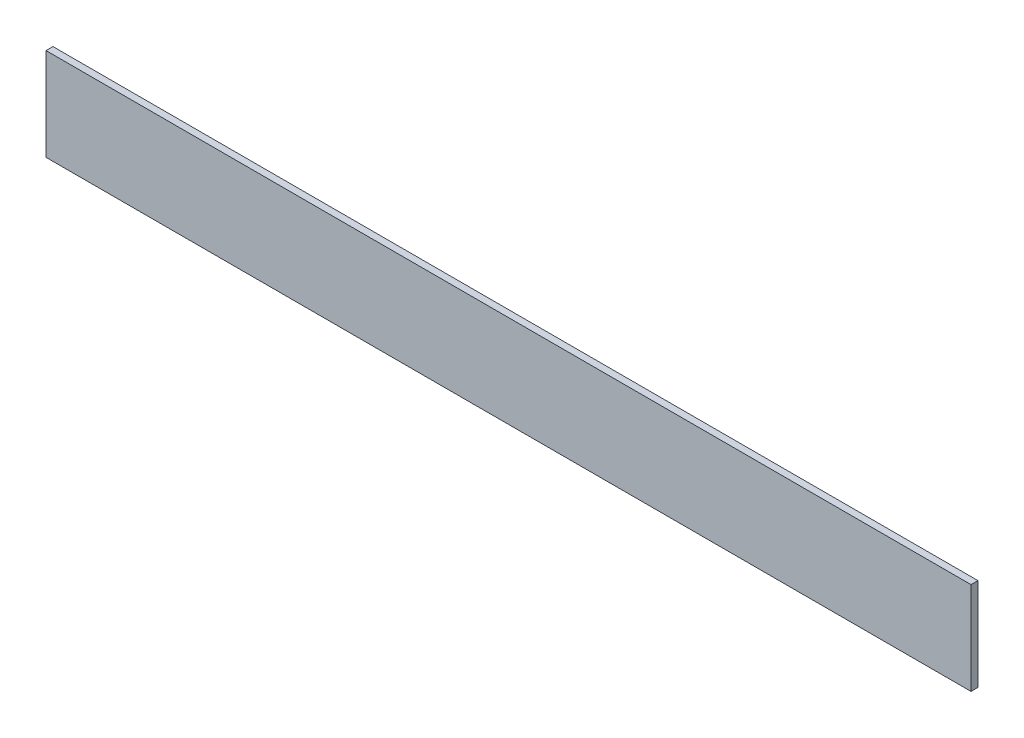
ISO-10303-21;
HEADER;
FILE_DESCRIPTION(('STEP AP214'),'2;1');
FILE_NAME('part.step','',(''),(''),'','','');
FILE_SCHEMA(('AUTOMOTIVE_DESIGN { 1 0 10303 214 1 1 1 1 }'));
ENDSEC;
DATA;
#1=APPLICATION_CONTEXT('core data for automotive mechanical design processes');
#2=APPLICATION_PROTOCOL_DEFINITION('international standard','automotive_design',2000,#1);
#3=PRODUCT_CONTEXT('',#1,'mechanical');
#4=PRODUCT('Part','Part','',(#3));
#5=PRODUCT_RELATED_PRODUCT_CATEGORY('part','',(#4));
#6=PRODUCT_DEFINITION_FORMATION('','',#4);
#7=PRODUCT_DEFINITION_CONTEXT('part definition',#1,'design');
#8=PRODUCT_DEFINITION('design','',#6,#7);
#9=PRODUCT_DEFINITION_SHAPE('','',#8);
#10=(LENGTH_UNIT() NAMED_UNIT(*) SI_UNIT(.MILLI.,.METRE.));
#11=(NAMED_UNIT(*) PLANE_ANGLE_UNIT() SI_UNIT($,.RADIAN.));
#12=(NAMED_UNIT(*) SI_UNIT($,.STERADIAN.) SOLID_ANGLE_UNIT());
#13=UNCERTAINTY_MEASURE_WITH_UNIT(LENGTH_MEASURE(1.E-05),#10,'distance_accuracy_value','');
#14=(GEOMETRIC_REPRESENTATION_CONTEXT(3) GLOBAL_UNCERTAINTY_ASSIGNED_CONTEXT((#13)) GLOBAL_UNIT_ASSIGNED_CONTEXT((#10,
#11,#12)) REPRESENTATION_CONTEXT('',''));
#15=CARTESIAN_POINT('',(0.,0.,0.));
#16=DIRECTION('',(0.,0.,1.));
#17=DIRECTION('',(1.,0.,0.));
#18=AXIS2_PLACEMENT_3D('',#15,#16,#17);
#19=CARTESIAN_POINT('',(-48.7333333333333,76.6666666666666,7.62));
#20=DIRECTION('',(1.,0.,0.));
#21=DIRECTION('',(0.,0.,-1.));
#22=AXIS2_PLACEMENT_3D('',#19,#20,#21);
#23=PLANE('',#22);
#24=DIRECTION('',(0.,-1.,0.));
#25=VECTOR('',#24,1.);
#26=CARTESIAN_POINT('',(-48.7333333333333,76.6666666666666,0.));
#27=LINE('',#26,#25);
#28=CARTESIAN_POINT('',(-48.7333333333333,76.6666666666666,0.));
#29=VERTEX_POINT('',#28);
#30=CARTESIAN_POINT('',(-48.7333333333333,-24.9333333333333,0.));
#31=VERTEX_POINT('',#30);
#32=EDGE_CURVE('E89',#29,#31,#27,.T.);
#33=ORIENTED_EDGE('',*,*,#32,.T.);
#34=DIRECTION('',(0.,0.,-1.));
#35=VECTOR('',#34,1.);
#36=CARTESIAN_POINT('',(-48.7333333333333,-24.9333333333333,7.62));
#37=LINE('',#36,#35);
#38=CARTESIAN_POINT('',(-48.7333333333333,-24.9333333333333,7.62));
#39=VERTEX_POINT('',#38);
#40=EDGE_CURVE('E12',#39,#31,#37,.T.);
#41=ORIENTED_EDGE('',*,*,#40,.F.);
#42=DIRECTION('',(0.,-1.,0.));
#43=VECTOR('',#42,1.);
#44=CARTESIAN_POINT('',(-48.7333333333333,76.6666666666666,7.62));
#45=LINE('',#44,#43);
#46=CARTESIAN_POINT('',(-48.7333333333333,76.6666666666666,7.62));
#47=VERTEX_POINT('',#46);
#48=EDGE_CURVE('E107',#47,#39,#45,.T.);
#49=ORIENTED_EDGE('',*,*,#48,.F.);
#50=DIRECTION('',(0.,0.,-1.));
#51=VECTOR('',#50,1.);
#52=CARTESIAN_POINT('',(-48.7333333333333,76.6666666666666,7.62));
#53=LINE('',#52,#51);
#54=EDGE_CURVE('E101',#47,#29,#53,.T.);
#55=ORIENTED_EDGE('',*,*,#54,.T.);
#56=EDGE_LOOP('',(#33,#41,#49,#55));
#57=FACE_BOUND('',#56,.T.);
#58=ADVANCED_FACE('F44',(#57),#23,.F.);
#59=CARTESIAN_POINT('',(-48.7333333333333,-24.9333333333333,7.62));
#60=DIRECTION('',(0.,1.,0.));
#61=DIRECTION('',(0.,0.,1.));
#62=AXIS2_PLACEMENT_3D('',#59,#60,#61);
#63=PLANE('',#62);
#64=DIRECTION('',(1.,0.,0.));
#65=VECTOR('',#64,1.);
#66=CARTESIAN_POINT('',(-48.7333333333333,-24.9333333333333,0.));
#67=LINE('',#66,#65);
#68=CARTESIAN_POINT('',(967.266666666667,-24.9333333333333,0.));
#69=VERTEX_POINT('',#68);
#70=EDGE_CURVE('E85',#31,#69,#67,.T.);
#71=ORIENTED_EDGE('',*,*,#70,.T.);
#72=DIRECTION('',(0.,0.,-1.));
#73=VECTOR('',#72,1.);
#74=CARTESIAN_POINT('',(967.266666666667,-24.9333333333333,7.62));
#75=LINE('',#74,#73);
#76=CARTESIAN_POINT('',(967.266666666667,-24.9333333333333,7.62));
#77=VERTEX_POINT('',#76);
#78=EDGE_CURVE('E52',#77,#69,#75,.T.);
#79=ORIENTED_EDGE('',*,*,#78,.F.);
#80=DIRECTION('',(1.,0.,0.));
#81=VECTOR('',#80,1.);
#82=CARTESIAN_POINT('',(-48.7333333333333,-24.9333333333333,7.62));
#83=LINE('',#82,#81);
#84=EDGE_CURVE('E97',#39,#77,#83,.T.);
#85=ORIENTED_EDGE('',*,*,#84,.F.);
#86=ORIENTED_EDGE('',*,*,#40,.T.);
#87=EDGE_LOOP('',(#71,#79,#85,#86));
#88=FACE_BOUND('',#87,.T.);
#89=ADVANCED_FACE('F96',(#88),#63,.F.);
#90=CARTESIAN_POINT('',(967.266666666667,76.6666666666666,7.62));
#91=DIRECTION('',(-1.,0.,0.));
#92=DIRECTION('',(0.,0.,1.));
#93=AXIS2_PLACEMENT_3D('',#90,#91,#92);
#94=PLANE('',#93);
#95=DIRECTION('',(0.,1.,0.));
#96=VECTOR('',#95,1.);
#97=CARTESIAN_POINT('',(967.266666666667,76.6666666666666,0.));
#98=LINE('',#97,#96);
#99=CARTESIAN_POINT('',(967.266666666667,76.6666666666666,0.));
#100=VERTEX_POINT('',#99);
#101=EDGE_CURVE('E90',#69,#100,#98,.T.);
#102=ORIENTED_EDGE('',*,*,#101,.T.);
#103=DIRECTION('',(0.,0.,-1.));
#104=VECTOR('',#103,1.);
#105=CARTESIAN_POINT('',(967.266666666667,76.6666666666666,7.62));
#106=LINE('',#105,#104);
#107=CARTESIAN_POINT('',(967.266666666667,76.6666666666666,7.62));
#108=VERTEX_POINT('',#107);
#109=EDGE_CURVE('E113',#108,#100,#106,.T.);
#110=ORIENTED_EDGE('',*,*,#109,.F.);
#111=DIRECTION('',(0.,1.,0.));
#112=VECTOR('',#111,1.);
#113=CARTESIAN_POINT('',(967.266666666667,76.6666666666666,7.62));
#114=LINE('',#113,#112);
#115=EDGE_CURVE('E64',#77,#108,#114,.T.);
#116=ORIENTED_EDGE('',*,*,#115,.F.);
#117=ORIENTED_EDGE('',*,*,#78,.T.);
#118=EDGE_LOOP('',(#102,#110,#116,#117));
#119=FACE_BOUND('',#118,.T.);
#120=ADVANCED_FACE('F116',(#119),#94,.F.);
#121=CARTESIAN_POINT('',(-48.7333333333333,76.6666666666666,7.62));
#122=DIRECTION('',(0.,-1.,0.));
#123=DIRECTION('',(0.,0.,-1.));
#124=AXIS2_PLACEMENT_3D('',#121,#122,#123);
#125=PLANE('',#124);
#126=DIRECTION('',(-1.,0.,0.));
#127=VECTOR('',#126,1.);
#128=CARTESIAN_POINT('',(-48.7333333333333,76.6666666666666,0.));
#129=LINE('',#128,#127);
#130=EDGE_CURVE('E105',#100,#29,#129,.T.);
#131=ORIENTED_EDGE('',*,*,#130,.T.);
#132=ORIENTED_EDGE('',*,*,#54,.F.);
#133=DIRECTION('',(-1.,0.,0.));
#134=VECTOR('',#133,1.);
#135=CARTESIAN_POINT('',(-48.7333333333333,76.6666666666666,7.62));
#136=LINE('',#135,#134);
#137=EDGE_CURVE('E59',#108,#47,#136,.T.);
#138=ORIENTED_EDGE('',*,*,#137,.F.);
#139=ORIENTED_EDGE('',*,*,#109,.T.);
#140=EDGE_LOOP('',(#131,#132,#138,#139));
#141=FACE_BOUND('',#140,.T.);
#142=ADVANCED_FACE('F118',(#141),#125,.F.);
#143=CARTESIAN_POINT('',(-48.7333333333333,-24.9333333333333,7.62));
#144=DIRECTION('',(0.,0.,1.));
#145=DIRECTION('',(1.,0.,0.));
#146=AXIS2_PLACEMENT_3D('',#143,#144,#145);
#147=PLANE('',#146);
#148=ORIENTED_EDGE('',*,*,#48,.T.);
#149=ORIENTED_EDGE('',*,*,#84,.T.);
#150=ORIENTED_EDGE('',*,*,#115,.T.);
#151=ORIENTED_EDGE('',*,*,#137,.T.);
#152=EDGE_LOOP('',(#148,#149,#150,#151));
#153=FACE_BOUND('',#152,.T.);
#154=ADVANCED_FACE('F119',(#153),#147,.T.);
#155=CARTESIAN_POINT('',(-48.7333333333333,-24.9333333333333,0.));
#156=DIRECTION('',(0.,0.,1.));
#157=DIRECTION('',(1.,0.,0.));
#158=AXIS2_PLACEMENT_3D('',#155,#156,#157);
#159=PLANE('',#158);
#160=ORIENTED_EDGE('',*,*,#32,.F.);
#161=ORIENTED_EDGE('',*,*,#130,.F.);
#162=ORIENTED_EDGE('',*,*,#101,.F.);
#163=ORIENTED_EDGE('',*,*,#70,.F.);
#164=EDGE_LOOP('',(#160,#161,#162,#163));
#165=FACE_BOUND('',#164,.T.);
#166=ADVANCED_FACE('F86',(#165),#159,.F.);
#167=CLOSED_SHELL('',(#58,#89,#120,#142,#154,#166));
#168=MANIFOLD_SOLID_BREP('B2',#167);
#169=ADVANCED_BREP_SHAPE_REPRESENTATION('',(#18,#168),#14);
#170=SHAPE_DEFINITION_REPRESENTATION(#9,#169);
ENDSEC;
END-ISO-10303-21;
